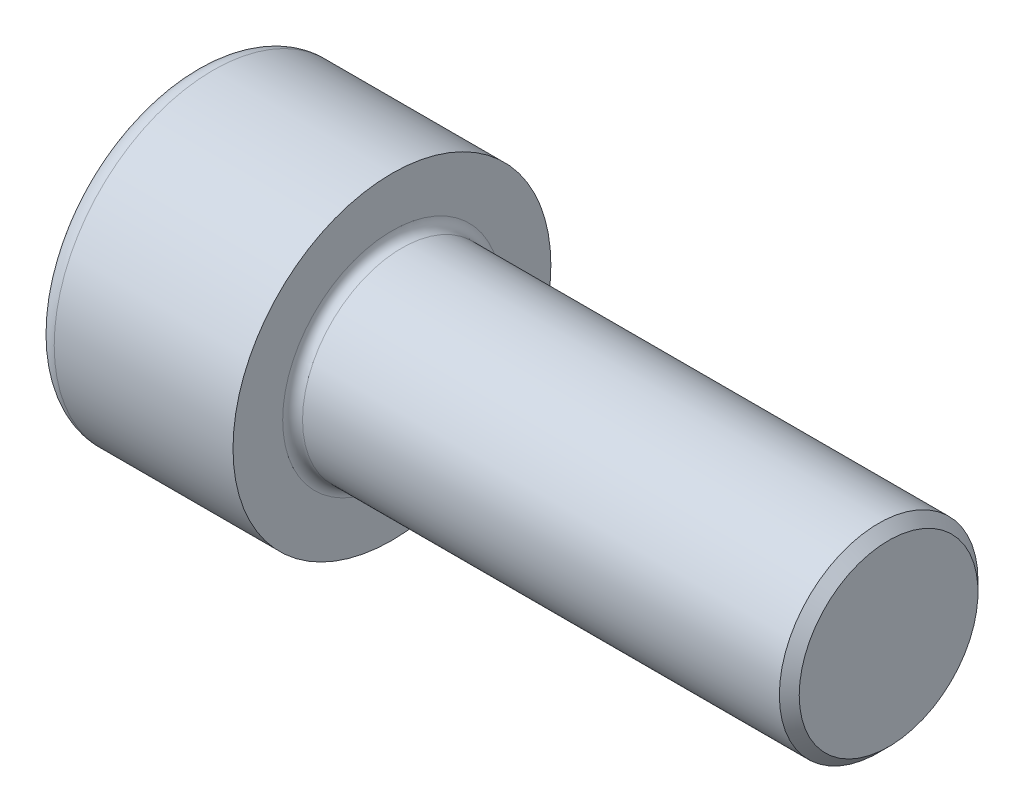
ISO-10303-21;
HEADER;
FILE_DESCRIPTION(('STEP AP214'),'2;1');
FILE_NAME('part.step','',(''),(''),'','','');
FILE_SCHEMA(('AUTOMOTIVE_DESIGN { 1 0 10303 214 1 1 1 1 }'));
ENDSEC;
DATA;
#1=APPLICATION_CONTEXT('core data for automotive mechanical design processes');
#2=APPLICATION_PROTOCOL_DEFINITION('international standard','automotive_design',2000,#1);
#3=PRODUCT_CONTEXT('',#1,'mechanical');
#4=PRODUCT('Part','Part','',(#3));
#5=PRODUCT_RELATED_PRODUCT_CATEGORY('part','',(#4));
#6=PRODUCT_DEFINITION_FORMATION('','',#4);
#7=PRODUCT_DEFINITION_CONTEXT('part definition',#1,'design');
#8=PRODUCT_DEFINITION('design','',#6,#7);
#9=PRODUCT_DEFINITION_SHAPE('','',#8);
#10=(LENGTH_UNIT() NAMED_UNIT(*) SI_UNIT(.MILLI.,.METRE.));
#11=(NAMED_UNIT(*) PLANE_ANGLE_UNIT() SI_UNIT($,.RADIAN.));
#12=(NAMED_UNIT(*) SI_UNIT($,.STERADIAN.) SOLID_ANGLE_UNIT());
#13=UNCERTAINTY_MEASURE_WITH_UNIT(LENGTH_MEASURE(1.E-05),#10,'distance_accuracy_value','');
#14=(GEOMETRIC_REPRESENTATION_CONTEXT(3) GLOBAL_UNCERTAINTY_ASSIGNED_CONTEXT((#13)) GLOBAL_UNIT_ASSIGNED_CONTEXT((#10,
#11,#12)) REPRESENTATION_CONTEXT('',''));
#15=CARTESIAN_POINT('',(0.,0.,0.));
#16=DIRECTION('',(0.,0.,1.));
#17=DIRECTION('',(1.,0.,0.));
#18=AXIS2_PLACEMENT_3D('',#15,#16,#17);
#19=CARTESIAN_POINT('',(0.,0.,0.));
#20=DIRECTION('',(1.,0.,0.));
#21=DIRECTION('',(0.,0.,-1.));
#22=AXIS2_PLACEMENT_3D('',#19,#20,#21);
#23=PLANE('',#22);
#24=CARTESIAN_POINT('',(0.,0.,0.));
#25=DIRECTION('',(1.,0.,0.));
#26=DIRECTION('',(0.,0.,-1.));
#27=AXIS2_PLACEMENT_3D('',#24,#25,#26);
#28=CIRCLE('',#27,7.);
#29=CARTESIAN_POINT('',(0.,0.,-7.));
#30=VERTEX_POINT('',#29);
#31=EDGE_CURVE('E143',#30,#30,#28,.F.);
#32=ORIENTED_EDGE('',*,*,#31,.T.);
#33=EDGE_LOOP('',(#32));
#34=FACE_BOUND('',#33,.T.);
#35=DIRECTION('',(0.,-0.5,-0.866025403784439));
#36=VECTOR('',#35,1.);
#37=CARTESIAN_POINT('',(0.,4.61880215351701,0.));
#38=LINE('',#37,#36);
#39=CARTESIAN_POINT('',(0.,4.61880215351701,0.));
#40=VERTEX_POINT('',#39);
#41=CARTESIAN_POINT('',(0.,2.30940107675851,-4.));
#42=VERTEX_POINT('',#41);
#43=EDGE_CURVE('E122',#40,#42,#38,.T.);
#44=ORIENTED_EDGE('',*,*,#43,.F.);
#45=DIRECTION('',(0.,0.5,-0.866025403784439));
#46=VECTOR('',#45,1.);
#47=CARTESIAN_POINT('',(0.,2.3094010767585,4.));
#48=LINE('',#47,#46);
#49=CARTESIAN_POINT('',(0.,2.3094010767585,4.));
#50=VERTEX_POINT('',#49);
#51=EDGE_CURVE('E48',#50,#40,#48,.T.);
#52=ORIENTED_EDGE('',*,*,#51,.F.);
#53=DIRECTION('',(0.,1.,0.));
#54=VECTOR('',#53,1.);
#55=CARTESIAN_POINT('',(0.,-2.30940107675851,4.));
#56=LINE('',#55,#54);
#57=CARTESIAN_POINT('',(0.,-2.30940107675851,4.));
#58=VERTEX_POINT('',#57);
#59=EDGE_CURVE('E131',#58,#50,#56,.T.);
#60=ORIENTED_EDGE('',*,*,#59,.F.);
#61=DIRECTION('',(0.,0.5,0.866025403784439));
#62=VECTOR('',#61,1.);
#63=CARTESIAN_POINT('',(0.,-4.61880215351701,0.));
#64=LINE('',#63,#62);
#65=CARTESIAN_POINT('',(0.,-4.61880215351701,0.));
#66=VERTEX_POINT('',#65);
#67=EDGE_CURVE('E129',#66,#58,#64,.T.);
#68=ORIENTED_EDGE('',*,*,#67,.F.);
#69=DIRECTION('',(0.,-0.5,0.866025403784439));
#70=VECTOR('',#69,1.);
#71=CARTESIAN_POINT('',(0.,-2.3094010767585,-4.));
#72=LINE('',#71,#70);
#73=CARTESIAN_POINT('',(0.,-2.3094010767585,-4.));
#74=VERTEX_POINT('',#73);
#75=EDGE_CURVE('E96',#74,#66,#72,.T.);
#76=ORIENTED_EDGE('',*,*,#75,.F.);
#77=DIRECTION('',(0.,-1.,0.));
#78=VECTOR('',#77,1.);
#79=CARTESIAN_POINT('',(0.,2.30940107675851,-4.));
#80=LINE('',#79,#78);
#81=EDGE_CURVE('E125',#42,#74,#80,.T.);
#82=ORIENTED_EDGE('',*,*,#81,.F.);
#83=EDGE_LOOP('',(#44,#52,#60,#68,#76,#82));
#84=FACE_BOUND('',#83,.T.);
#85=ADVANCED_FACE('F33',(#34,#84),#23,.F.);
#86=CARTESIAN_POINT('',(0.,0.,0.));
#87=DIRECTION('',(-1.,0.,0.));
#88=DIRECTION('',(0.,0.,1.));
#89=AXIS2_PLACEMENT_3D('',#86,#87,#88);
#90=CYLINDRICAL_SURFACE('',#89,8.);
#91=CARTESIAN_POINT('',(1.,0.,0.));
#92=DIRECTION('',(1.,0.,0.));
#93=DIRECTION('',(0.,0.,-1.));
#94=AXIS2_PLACEMENT_3D('',#91,#92,#93);
#95=CIRCLE('',#94,8.);
#96=CARTESIAN_POINT('',(1.,0.,-8.));
#97=VERTEX_POINT('',#96);
#98=EDGE_CURVE('E146',#97,#97,#95,.T.);
#99=ORIENTED_EDGE('',*,*,#98,.T.);
#100=EDGE_LOOP('',(#99));
#101=FACE_BOUND('',#100,.T.);
#102=CARTESIAN_POINT('',(10.,0.,0.));
#103=DIRECTION('',(-1.,0.,0.));
#104=DIRECTION('',(0.,0.,1.));
#105=AXIS2_PLACEMENT_3D('',#102,#103,#104);
#106=CIRCLE('',#105,8.);
#107=CARTESIAN_POINT('',(10.,0.,8.));
#108=VERTEX_POINT('',#107);
#109=EDGE_CURVE('E135',#108,#108,#106,.T.);
#110=ORIENTED_EDGE('',*,*,#109,.T.);
#111=EDGE_LOOP('',(#110));
#112=FACE_BOUND('',#111,.T.);
#113=ADVANCED_FACE('F170',(#101,#112),#90,.T.);
#114=CARTESIAN_POINT('',(10.,8.,0.));
#115=DIRECTION('',(-1.,0.,0.));
#116=DIRECTION('',(0.,0.,1.));
#117=AXIS2_PLACEMENT_3D('',#114,#115,#116);
#118=PLANE('',#117);
#119=CARTESIAN_POINT('',(10.,0.,0.));
#120=DIRECTION('',(-1.,0.,0.));
#121=DIRECTION('',(0.,0.,1.));
#122=AXIS2_PLACEMENT_3D('',#119,#120,#121);
#123=CIRCLE('',#122,5.5);
#124=CARTESIAN_POINT('',(10.,0.,5.5));
#125=VERTEX_POINT('',#124);
#126=EDGE_CURVE('E149',#125,#125,#123,.T.);
#127=ORIENTED_EDGE('',*,*,#126,.T.);
#128=EDGE_LOOP('',(#127));
#129=FACE_BOUND('',#128,.T.);
#130=ORIENTED_EDGE('',*,*,#109,.F.);
#131=EDGE_LOOP('',(#130));
#132=FACE_BOUND('',#131,.T.);
#133=ADVANCED_FACE('F176',(#129,#132),#118,.F.);
#134=CARTESIAN_POINT('',(0.,0.,0.));
#135=DIRECTION('',(-1.,0.,0.));
#136=DIRECTION('',(0.,0.,1.));
#137=AXIS2_PLACEMENT_3D('',#134,#135,#136);
#138=CYLINDRICAL_SURFACE('',#137,5.);
#139=CARTESIAN_POINT('',(34.5,0.,0.));
#140=DIRECTION('',(-1.,0.,0.));
#141=DIRECTION('',(0.,0.,1.));
#142=AXIS2_PLACEMENT_3D('',#139,#140,#141);
#143=CIRCLE('',#142,5.);
#144=CARTESIAN_POINT('',(34.5,0.,5.));
#145=VERTEX_POINT('',#144);
#146=EDGE_CURVE('E41',#145,#145,#143,.T.);
#147=ORIENTED_EDGE('',*,*,#146,.T.);
#148=EDGE_LOOP('',(#147));
#149=FACE_BOUND('',#148,.T.);
#150=CARTESIAN_POINT('',(10.5,0.,0.));
#151=DIRECTION('',(-1.,0.,0.));
#152=DIRECTION('',(0.,0.,1.));
#153=AXIS2_PLACEMENT_3D('',#150,#151,#152);
#154=CIRCLE('',#153,5.);
#155=CARTESIAN_POINT('',(10.5,0.,5.));
#156=VERTEX_POINT('',#155);
#157=EDGE_CURVE('E152',#156,#156,#154,.F.);
#158=ORIENTED_EDGE('',*,*,#157,.T.);
#159=EDGE_LOOP('',(#158));
#160=FACE_BOUND('',#159,.T.);
#161=ADVANCED_FACE('F157',(#149,#160),#138,.T.);
#162=CARTESIAN_POINT('',(35.,5.,0.));
#163=DIRECTION('',(-1.,0.,0.));
#164=DIRECTION('',(0.,0.,1.));
#165=AXIS2_PLACEMENT_3D('',#162,#163,#164);
#166=PLANE('',#165);
#167=CARTESIAN_POINT('',(35.,0.,0.));
#168=DIRECTION('',(-1.,0.,0.));
#169=DIRECTION('',(0.,0.,1.));
#170=AXIS2_PLACEMENT_3D('',#167,#168,#169);
#171=CIRCLE('',#170,4.50000000000001);
#172=CARTESIAN_POINT('',(35.,0.,4.50000000000001));
#173=VERTEX_POINT('',#172);
#174=EDGE_CURVE('E11',#173,#173,#171,.F.);
#175=ORIENTED_EDGE('',*,*,#174,.T.);
#176=EDGE_LOOP('',(#175));
#177=FACE_BOUND('',#176,.T.);
#178=ADVANCED_FACE('F200',(#177),#166,.F.);
#179=CARTESIAN_POINT('',(5.,2.3094010767585,4.));
#180=DIRECTION('',(0.,0.866025403784439,0.5));
#181=DIRECTION('',(0.,-0.5,0.866025403784439));
#182=AXIS2_PLACEMENT_3D('',#179,#180,#181);
#183=PLANE('',#182);
#184=ORIENTED_EDGE('',*,*,#51,.T.);
#185=DIRECTION('',(-1.,0.,0.));
#186=VECTOR('',#185,1.);
#187=CARTESIAN_POINT('',(5.,4.61880215351701,0.));
#188=LINE('',#187,#186);
#189=CARTESIAN_POINT('',(5.,4.61880215351701,0.));
#190=VERTEX_POINT('',#189);
#191=EDGE_CURVE('E78',#190,#40,#188,.T.);
#192=ORIENTED_EDGE('',*,*,#191,.F.);
#193=DIRECTION('',(0.,0.5,-0.866025403784439));
#194=VECTOR('',#193,1.);
#195=CARTESIAN_POINT('',(5.,2.3094010767585,4.));
#196=LINE('',#195,#194);
#197=CARTESIAN_POINT('',(5.,2.3094010767585,4.));
#198=VERTEX_POINT('',#197);
#199=EDGE_CURVE('E133',#198,#190,#196,.T.);
#200=ORIENTED_EDGE('',*,*,#199,.F.);
#201=DIRECTION('',(-1.,0.,0.));
#202=VECTOR('',#201,1.);
#203=CARTESIAN_POINT('',(5.,2.3094010767585,4.));
#204=LINE('',#203,#202);
#205=EDGE_CURVE('E56',#198,#50,#204,.T.);
#206=ORIENTED_EDGE('',*,*,#205,.T.);
#207=EDGE_LOOP('',(#184,#192,#200,#206));
#208=FACE_BOUND('',#207,.T.);
#209=ADVANCED_FACE('F205',(#208),#183,.F.);
#210=CARTESIAN_POINT('',(5.,-2.30940107675851,4.));
#211=DIRECTION('',(0.,0.,1.));
#212=DIRECTION('',(0.,-1.,0.));
#213=AXIS2_PLACEMENT_3D('',#210,#211,#212);
#214=PLANE('',#213);
#215=ORIENTED_EDGE('',*,*,#59,.T.);
#216=ORIENTED_EDGE('',*,*,#205,.F.);
#217=DIRECTION('',(0.,1.,0.));
#218=VECTOR('',#217,1.);
#219=CARTESIAN_POINT('',(5.,-2.30940107675851,4.));
#220=LINE('',#219,#218);
#221=CARTESIAN_POINT('',(5.,-2.30940107675851,4.));
#222=VERTEX_POINT('',#221);
#223=EDGE_CURVE('E108',#222,#198,#220,.T.);
#224=ORIENTED_EDGE('',*,*,#223,.F.);
#225=DIRECTION('',(-1.,0.,0.));
#226=VECTOR('',#225,1.);
#227=CARTESIAN_POINT('',(5.,-2.30940107675851,4.));
#228=LINE('',#227,#226);
#229=EDGE_CURVE('E100',#222,#58,#228,.T.);
#230=ORIENTED_EDGE('',*,*,#229,.T.);
#231=EDGE_LOOP('',(#215,#216,#224,#230));
#232=FACE_BOUND('',#231,.T.);
#233=ADVANCED_FACE('F209',(#232),#214,.F.);
#234=CARTESIAN_POINT('',(5.,-4.61880215351701,0.));
#235=DIRECTION('',(0.,-0.866025403784439,0.5));
#236=DIRECTION('',(0.,-0.5,-0.866025403784439));
#237=AXIS2_PLACEMENT_3D('',#234,#235,#236);
#238=PLANE('',#237);
#239=ORIENTED_EDGE('',*,*,#67,.T.);
#240=ORIENTED_EDGE('',*,*,#229,.F.);
#241=DIRECTION('',(0.,0.5,0.866025403784439));
#242=VECTOR('',#241,1.);
#243=CARTESIAN_POINT('',(5.,-4.61880215351701,0.));
#244=LINE('',#243,#242);
#245=CARTESIAN_POINT('',(5.,-4.61880215351701,0.));
#246=VERTEX_POINT('',#245);
#247=EDGE_CURVE('E104',#246,#222,#244,.T.);
#248=ORIENTED_EDGE('',*,*,#247,.F.);
#249=DIRECTION('',(-1.,0.,0.));
#250=VECTOR('',#249,1.);
#251=CARTESIAN_POINT('',(5.,-4.61880215351701,0.));
#252=LINE('',#251,#250);
#253=EDGE_CURVE('E89',#246,#66,#252,.T.);
#254=ORIENTED_EDGE('',*,*,#253,.T.);
#255=EDGE_LOOP('',(#239,#240,#248,#254));
#256=FACE_BOUND('',#255,.T.);
#257=ADVANCED_FACE('F105',(#256),#238,.F.);
#258=CARTESIAN_POINT('',(5.,-2.3094010767585,-4.));
#259=DIRECTION('',(0.,-0.866025403784439,-0.5));
#260=DIRECTION('',(0.,0.5,-0.866025403784439));
#261=AXIS2_PLACEMENT_3D('',#258,#259,#260);
#262=PLANE('',#261);
#263=ORIENTED_EDGE('',*,*,#75,.T.);
#264=ORIENTED_EDGE('',*,*,#253,.F.);
#265=DIRECTION('',(0.,-0.5,0.866025403784439));
#266=VECTOR('',#265,1.);
#267=CARTESIAN_POINT('',(5.,-2.3094010767585,-4.));
#268=LINE('',#267,#266);
#269=CARTESIAN_POINT('',(5.,-2.3094010767585,-4.));
#270=VERTEX_POINT('',#269);
#271=EDGE_CURVE('E93',#270,#246,#268,.T.);
#272=ORIENTED_EDGE('',*,*,#271,.F.);
#273=DIRECTION('',(-1.,0.,0.));
#274=VECTOR('',#273,1.);
#275=CARTESIAN_POINT('',(5.,-2.3094010767585,-4.));
#276=LINE('',#275,#274);
#277=EDGE_CURVE('E101',#270,#74,#276,.T.);
#278=ORIENTED_EDGE('',*,*,#277,.T.);
#279=EDGE_LOOP('',(#263,#264,#272,#278));
#280=FACE_BOUND('',#279,.T.);
#281=ADVANCED_FACE('F91',(#280),#262,.F.);
#282=CARTESIAN_POINT('',(5.,2.30940107675851,-4.));
#283=DIRECTION('',(0.,0.,-1.));
#284=DIRECTION('',(0.,1.,0.));
#285=AXIS2_PLACEMENT_3D('',#282,#283,#284);
#286=PLANE('',#285);
#287=ORIENTED_EDGE('',*,*,#81,.T.);
#288=ORIENTED_EDGE('',*,*,#277,.F.);
#289=DIRECTION('',(0.,-1.,0.));
#290=VECTOR('',#289,1.);
#291=CARTESIAN_POINT('',(5.,2.30940107675851,-4.));
#292=LINE('',#291,#290);
#293=CARTESIAN_POINT('',(5.,2.30940107675851,-4.));
#294=VERTEX_POINT('',#293);
#295=EDGE_CURVE('E114',#294,#270,#292,.T.);
#296=ORIENTED_EDGE('',*,*,#295,.F.);
#297=DIRECTION('',(-1.,0.,0.));
#298=VECTOR('',#297,1.);
#299=CARTESIAN_POINT('',(5.,2.30940107675851,-4.));
#300=LINE('',#299,#298);
#301=EDGE_CURVE('E138',#294,#42,#300,.T.);
#302=ORIENTED_EDGE('',*,*,#301,.T.);
#303=EDGE_LOOP('',(#287,#288,#296,#302));
#304=FACE_BOUND('',#303,.T.);
#305=ADVANCED_FACE('F212',(#304),#286,.F.);
#306=CARTESIAN_POINT('',(5.,4.61880215351701,0.));
#307=DIRECTION('',(0.,0.866025403784439,-0.5));
#308=DIRECTION('',(0.,0.5,0.866025403784439));
#309=AXIS2_PLACEMENT_3D('',#306,#307,#308);
#310=PLANE('',#309);
#311=ORIENTED_EDGE('',*,*,#43,.T.);
#312=ORIENTED_EDGE('',*,*,#301,.F.);
#313=DIRECTION('',(0.,-0.5,-0.866025403784439));
#314=VECTOR('',#313,1.);
#315=CARTESIAN_POINT('',(5.,4.61880215351701,0.));
#316=LINE('',#315,#314);
#317=EDGE_CURVE('E116',#190,#294,#316,.T.);
#318=ORIENTED_EDGE('',*,*,#317,.F.);
#319=ORIENTED_EDGE('',*,*,#191,.T.);
#320=EDGE_LOOP('',(#311,#312,#318,#319));
#321=FACE_BOUND('',#320,.T.);
#322=ADVANCED_FACE('F187',(#321),#310,.F.);
#323=CARTESIAN_POINT('',(5.,0.,0.));
#324=DIRECTION('',(-1.,0.,0.));
#325=DIRECTION('',(0.,0.,1.));
#326=AXIS2_PLACEMENT_3D('',#323,#324,#325);
#327=PLANE('',#326);
#328=ORIENTED_EDGE('',*,*,#199,.T.);
#329=ORIENTED_EDGE('',*,*,#317,.T.);
#330=ORIENTED_EDGE('',*,*,#295,.T.);
#331=ORIENTED_EDGE('',*,*,#271,.T.);
#332=ORIENTED_EDGE('',*,*,#247,.T.);
#333=ORIENTED_EDGE('',*,*,#223,.T.);
#334=EDGE_LOOP('',(#328,#329,#330,#331,#332,#333));
#335=FACE_BOUND('',#334,.T.);
#336=ADVANCED_FACE('F111',(#335),#327,.T.);
#337=CARTESIAN_POINT('',(1.,0.,0.));
#338=DIRECTION('',(1.,0.,0.));
#339=DIRECTION('',(0.,0.,-1.));
#340=AXIS2_PLACEMENT_3D('',#337,#338,#339);
#341=TOROIDAL_SURFACE('',#340,7.,1.);
#342=ORIENTED_EDGE('',*,*,#98,.F.);
#343=EDGE_LOOP('',(#342));
#344=FACE_BOUND('',#343,.T.);
#345=ORIENTED_EDGE('',*,*,#31,.F.);
#346=EDGE_LOOP('',(#345));
#347=FACE_BOUND('',#346,.T.);
#348=ADVANCED_FACE('F166',(#344,#347),#341,.T.);
#349=CARTESIAN_POINT('',(10.5,0.,0.));
#350=DIRECTION('',(-1.,0.,0.));
#351=DIRECTION('',(0.,0.,1.));
#352=AXIS2_PLACEMENT_3D('',#349,#350,#351);
#353=TOROIDAL_SURFACE('',#352,5.5,0.5);
#354=ORIENTED_EDGE('',*,*,#157,.F.);
#355=EDGE_LOOP('',(#354));
#356=FACE_BOUND('',#355,.T.);
#357=ORIENTED_EDGE('',*,*,#126,.F.);
#358=EDGE_LOOP('',(#357));
#359=FACE_BOUND('',#358,.T.);
#360=ADVANCED_FACE('F161',(#356,#359),#353,.F.);
#361=CARTESIAN_POINT('',(34.5,0.,0.));
#362=DIRECTION('',(-1.,0.,0.));
#363=DIRECTION('',(0.,0.,1.));
#364=AXIS2_PLACEMENT_3D('',#361,#362,#363);
#365=CONICAL_SURFACE('',#364,5.,0.785398163397451);
#366=ORIENTED_EDGE('',*,*,#174,.F.);
#367=EDGE_LOOP('',(#366));
#368=FACE_BOUND('',#367,.T.);
#369=ORIENTED_EDGE('',*,*,#146,.F.);
#370=EDGE_LOOP('',(#369));
#371=FACE_BOUND('',#370,.T.);
#372=ADVANCED_FACE('F35',(#368,#371),#365,.T.);
#373=CLOSED_SHELL('',(#85,#113,#133,#161,#178,#209,#233,#257,#281,#305,#322,#336,#348,#360,#372));
#374=MANIFOLD_SOLID_BREP('B2',#373);
#375=ADVANCED_BREP_SHAPE_REPRESENTATION('',(#18,#374),#14);
#376=SHAPE_DEFINITION_REPRESENTATION(#9,#375);
ENDSEC;
END-ISO-10303-21;
